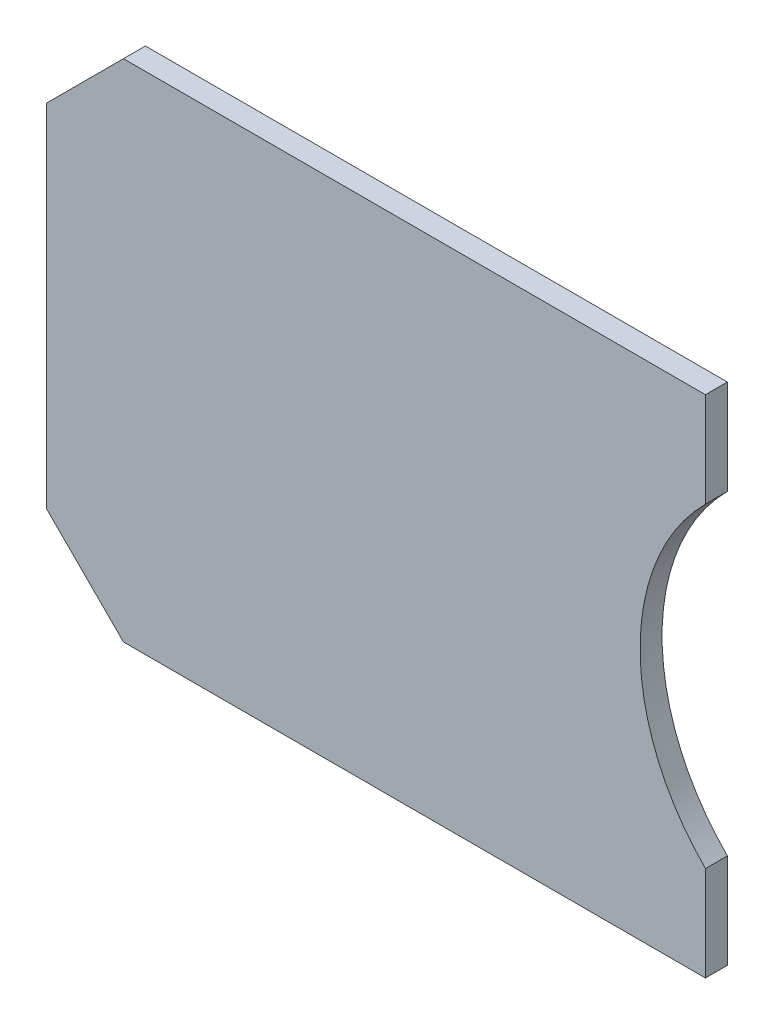
ISO-10303-21;
HEADER;
FILE_DESCRIPTION(('STEP AP214'),'2;1');
FILE_NAME('part.step','',(''),(''),'','','');
FILE_SCHEMA(('AUTOMOTIVE_DESIGN { 1 0 10303 214 1 1 1 1 }'));
ENDSEC;
DATA;
#1=APPLICATION_CONTEXT('core data for automotive mechanical design processes');
#2=APPLICATION_PROTOCOL_DEFINITION('international standard','automotive_design',2000,#1);
#3=PRODUCT_CONTEXT('',#1,'mechanical');
#4=PRODUCT('Part','Part','',(#3));
#5=PRODUCT_RELATED_PRODUCT_CATEGORY('part','',(#4));
#6=PRODUCT_DEFINITION_FORMATION('','',#4);
#7=PRODUCT_DEFINITION_CONTEXT('part definition',#1,'design');
#8=PRODUCT_DEFINITION('design','',#6,#7);
#9=PRODUCT_DEFINITION_SHAPE('','',#8);
#10=(LENGTH_UNIT() NAMED_UNIT(*) SI_UNIT(.MILLI.,.METRE.));
#11=(NAMED_UNIT(*) PLANE_ANGLE_UNIT() SI_UNIT($,.RADIAN.));
#12=(NAMED_UNIT(*) SI_UNIT($,.STERADIAN.) SOLID_ANGLE_UNIT());
#13=UNCERTAINTY_MEASURE_WITH_UNIT(LENGTH_MEASURE(1.E-05),#10,'distance_accuracy_value','');
#14=(GEOMETRIC_REPRESENTATION_CONTEXT(3) GLOBAL_UNCERTAINTY_ASSIGNED_CONTEXT((#13)) GLOBAL_UNIT_ASSIGNED_CONTEXT((#10,
#11,#12)) REPRESENTATION_CONTEXT('',''));
#15=CARTESIAN_POINT('',(0.,0.,0.));
#16=DIRECTION('',(0.,0.,1.));
#17=DIRECTION('',(1.,0.,0.));
#18=AXIS2_PLACEMENT_3D('',#15,#16,#17);
#19=CARTESIAN_POINT('',(20.45,-10.2865378923355,0.1));
#20=DIRECTION('',(1.,0.,0.));
#21=DIRECTION('',(0.,0.,-1.));
#22=AXIS2_PLACEMENT_3D('',#19,#20,#21);
#23=PLANE('',#22);
#24=DIRECTION('',(0.,-1.,0.));
#25=VECTOR('',#24,1.);
#26=CARTESIAN_POINT('',(20.45,-10.2865378923355,0.));
#27=LINE('',#26,#25);
#28=CARTESIAN_POINT('',(20.45,-10.2865378923355,0.));
#29=VERTEX_POINT('',#28);
#30=CARTESIAN_POINT('',(20.45,-10.7180262614696,0.));
#31=VERTEX_POINT('',#30);
#32=EDGE_CURVE('E135',#29,#31,#27,.T.);
#33=ORIENTED_EDGE('',*,*,#32,.F.);
#34=DIRECTION('',(0.,0.,-1.));
#35=VECTOR('',#34,1.);
#36=CARTESIAN_POINT('',(20.45,-10.2865378923355,0.1));
#37=LINE('',#36,#35);
#38=CARTESIAN_POINT('',(20.45,-10.2865378923355,0.1));
#39=VERTEX_POINT('',#38);
#40=EDGE_CURVE('E11',#39,#29,#37,.T.);
#41=ORIENTED_EDGE('',*,*,#40,.F.);
#42=DIRECTION('',(0.,-1.,0.));
#43=VECTOR('',#42,1.);
#44=CARTESIAN_POINT('',(20.45,-10.2865378923355,0.1));
#45=LINE('',#44,#43);
#46=CARTESIAN_POINT('',(20.45,-10.7180262614696,0.1));
#47=VERTEX_POINT('',#46);
#48=EDGE_CURVE('E154',#39,#47,#45,.T.);
#49=ORIENTED_EDGE('',*,*,#48,.T.);
#50=DIRECTION('',(0.,0.,-1.));
#51=VECTOR('',#50,1.);
#52=CARTESIAN_POINT('',(20.45,-10.7180262614696,0.1));
#53=LINE('',#52,#51);
#54=EDGE_CURVE('E42',#47,#31,#53,.T.);
#55=ORIENTED_EDGE('',*,*,#54,.T.);
#56=EDGE_LOOP('',(#33,#41,#49,#55));
#57=FACE_BOUND('',#56,.T.);
#58=ADVANCED_FACE('F39',(#57),#23,.T.);
#59=CARTESIAN_POINT('',(21.1685116308659,-9.56802626146959,0.1));
#60=DIRECTION('',(0.,0.,-1.));
#61=DIRECTION('',(-1.,0.,0.));
#62=AXIS2_PLACEMENT_3D('',#59,#60,#61);
#63=CYLINDRICAL_SURFACE('',#62,1.01612889309335);
#64=CARTESIAN_POINT('',(21.1685116308659,-9.56802626146959,0.));
#65=DIRECTION('',(0.,0.,1.));
#66=DIRECTION('',(1.,0.,0.));
#67=AXIS2_PLACEMENT_3D('',#64,#65,#66);
#68=CIRCLE('',#67,1.01612889309335);
#69=CARTESIAN_POINT('',(20.45,-8.8495146306037,0.));
#70=VERTEX_POINT('',#69);
#71=EDGE_CURVE('E152',#70,#29,#68,.T.);
#72=ORIENTED_EDGE('',*,*,#71,.F.);
#73=DIRECTION('',(0.,0.,-1.));
#74=VECTOR('',#73,1.);
#75=CARTESIAN_POINT('',(20.45,-8.8495146306037,0.1));
#76=LINE('',#75,#74);
#77=CARTESIAN_POINT('',(20.45,-8.8495146306037,0.1));
#78=VERTEX_POINT('',#77);
#79=EDGE_CURVE('E48',#78,#70,#76,.T.);
#80=ORIENTED_EDGE('',*,*,#79,.F.);
#81=CARTESIAN_POINT('',(21.1685116308659,-9.56802626146959,0.1));
#82=DIRECTION('',(0.,0.,1.));
#83=DIRECTION('',(1.,0.,0.));
#84=AXIS2_PLACEMENT_3D('',#81,#82,#83);
#85=CIRCLE('',#84,1.01612889309335);
#86=EDGE_CURVE('E115',#78,#39,#85,.T.);
#87=ORIENTED_EDGE('',*,*,#86,.T.);
#88=ORIENTED_EDGE('',*,*,#40,.T.);
#89=EDGE_LOOP('',(#72,#80,#87,#88));
#90=FACE_BOUND('',#89,.T.);
#91=ADVANCED_FACE('F167',(#90),#63,.F.);
#92=CARTESIAN_POINT('',(20.45,-8.8495146306037,0.1));
#93=DIRECTION('',(-1.,0.,0.));
#94=DIRECTION('',(0.,0.,1.));
#95=AXIS2_PLACEMENT_3D('',#92,#93,#94);
#96=PLANE('',#95);
#97=DIRECTION('',(0.,1.,0.));
#98=VECTOR('',#97,1.);
#99=CARTESIAN_POINT('',(20.45,-8.8495146306037,0.));
#100=LINE('',#99,#98);
#101=CARTESIAN_POINT('',(20.45,-8.41802626146959,0.));
#102=VERTEX_POINT('',#101);
#103=EDGE_CURVE('E120',#70,#102,#100,.T.);
#104=ORIENTED_EDGE('',*,*,#103,.T.);
#105=DIRECTION('',(0.,0.,-1.));
#106=VECTOR('',#105,1.);
#107=CARTESIAN_POINT('',(20.45,-8.41802626146959,0.1));
#108=LINE('',#107,#106);
#109=CARTESIAN_POINT('',(20.45,-8.41802626146959,0.1));
#110=VERTEX_POINT('',#109);
#111=EDGE_CURVE('E118',#110,#102,#108,.T.);
#112=ORIENTED_EDGE('',*,*,#111,.F.);
#113=DIRECTION('',(0.,1.,0.));
#114=VECTOR('',#113,1.);
#115=CARTESIAN_POINT('',(20.45,-8.8495146306037,0.1));
#116=LINE('',#115,#114);
#117=EDGE_CURVE('E109',#78,#110,#116,.T.);
#118=ORIENTED_EDGE('',*,*,#117,.F.);
#119=ORIENTED_EDGE('',*,*,#79,.T.);
#120=EDGE_LOOP('',(#104,#112,#118,#119));
#121=FACE_BOUND('',#120,.T.);
#122=ADVANCED_FACE('F119',(#121),#96,.F.);
#123=CARTESIAN_POINT('',(20.45,-8.41802626146959,0.1));
#124=DIRECTION('',(0.,-1.,0.));
#125=DIRECTION('',(0.,0.,-1.));
#126=AXIS2_PLACEMENT_3D('',#123,#124,#125);
#127=PLANE('',#126);
#128=DIRECTION('',(-1.,0.,0.));
#129=VECTOR('',#128,1.);
#130=CARTESIAN_POINT('',(20.45,-8.41802626146959,0.));
#131=LINE('',#130,#129);
#132=CARTESIAN_POINT('',(17.8,-8.41802626146959,0.));
#133=VERTEX_POINT('',#132);
#134=EDGE_CURVE('E149',#102,#133,#131,.T.);
#135=ORIENTED_EDGE('',*,*,#134,.T.);
#136=DIRECTION('',(0.,0.,-1.));
#137=VECTOR('',#136,1.);
#138=CARTESIAN_POINT('',(17.8,-8.41802626146959,0.1));
#139=LINE('',#138,#137);
#140=CARTESIAN_POINT('',(17.8,-8.41802626146959,0.1));
#141=VERTEX_POINT('',#140);
#142=EDGE_CURVE('E123',#141,#133,#139,.T.);
#143=ORIENTED_EDGE('',*,*,#142,.F.);
#144=DIRECTION('',(-1.,0.,0.));
#145=VECTOR('',#144,1.);
#146=CARTESIAN_POINT('',(20.45,-8.41802626146959,0.1));
#147=LINE('',#146,#145);
#148=EDGE_CURVE('E113',#110,#141,#147,.T.);
#149=ORIENTED_EDGE('',*,*,#148,.F.);
#150=ORIENTED_EDGE('',*,*,#111,.T.);
#151=EDGE_LOOP('',(#135,#143,#149,#150));
#152=FACE_BOUND('',#151,.T.);
#153=ADVANCED_FACE('F125',(#152),#127,.F.);
#154=CARTESIAN_POINT('',(17.8,-8.41802626146959,0.1));
#155=DIRECTION('',(0.707106781186546,-0.707106781186549,0.));
#156=DIRECTION('',(0.707106781186549,0.707106781186546,0.));
#157=AXIS2_PLACEMENT_3D('',#154,#155,#156);
#158=PLANE('',#157);
#159=DIRECTION('',(-0.707106781186549,-0.707106781186546,0.));
#160=VECTOR('',#159,1.);
#161=CARTESIAN_POINT('',(17.8,-8.41802626146959,0.));
#162=LINE('',#161,#160);
#163=CARTESIAN_POINT('',(17.45,-8.76802626146959,0.));
#164=VERTEX_POINT('',#163);
#165=EDGE_CURVE('E147',#133,#164,#162,.T.);
#166=ORIENTED_EDGE('',*,*,#165,.T.);
#167=DIRECTION('',(0.,0.,-1.));
#168=VECTOR('',#167,1.);
#169=CARTESIAN_POINT('',(17.45,-8.76802626146959,0.1));
#170=LINE('',#169,#168);
#171=CARTESIAN_POINT('',(17.45,-8.76802626146959,0.1));
#172=VERTEX_POINT('',#171);
#173=EDGE_CURVE('E158',#172,#164,#170,.T.);
#174=ORIENTED_EDGE('',*,*,#173,.F.);
#175=DIRECTION('',(-0.707106781186549,-0.707106781186546,0.));
#176=VECTOR('',#175,1.);
#177=CARTESIAN_POINT('',(17.8,-8.41802626146959,0.1));
#178=LINE('',#177,#176);
#179=EDGE_CURVE('E128',#141,#172,#178,.T.);
#180=ORIENTED_EDGE('',*,*,#179,.F.);
#181=ORIENTED_EDGE('',*,*,#142,.T.);
#182=EDGE_LOOP('',(#166,#174,#180,#181));
#183=FACE_BOUND('',#182,.T.);
#184=ADVANCED_FACE('F180',(#183),#158,.F.);
#185=CARTESIAN_POINT('',(17.45,-8.76802626146959,0.1));
#186=DIRECTION('',(1.,0.,0.));
#187=DIRECTION('',(0.,0.,-1.));
#188=AXIS2_PLACEMENT_3D('',#185,#186,#187);
#189=PLANE('',#188);
#190=DIRECTION('',(0.,-1.,0.));
#191=VECTOR('',#190,1.);
#192=CARTESIAN_POINT('',(17.45,-8.76802626146959,0.));
#193=LINE('',#192,#191);
#194=CARTESIAN_POINT('',(17.45,-10.3680262614696,0.));
#195=VERTEX_POINT('',#194);
#196=EDGE_CURVE('E144',#164,#195,#193,.T.);
#197=ORIENTED_EDGE('',*,*,#196,.T.);
#198=DIRECTION('',(0.,0.,-1.));
#199=VECTOR('',#198,1.);
#200=CARTESIAN_POINT('',(17.45,-10.3680262614696,0.1));
#201=LINE('',#200,#199);
#202=CARTESIAN_POINT('',(17.45,-10.3680262614696,0.1));
#203=VERTEX_POINT('',#202);
#204=EDGE_CURVE('E161',#203,#195,#201,.T.);
#205=ORIENTED_EDGE('',*,*,#204,.F.);
#206=DIRECTION('',(0.,-1.,0.));
#207=VECTOR('',#206,1.);
#208=CARTESIAN_POINT('',(17.45,-8.76802626146959,0.1));
#209=LINE('',#208,#207);
#210=EDGE_CURVE('E130',#172,#203,#209,.T.);
#211=ORIENTED_EDGE('',*,*,#210,.F.);
#212=ORIENTED_EDGE('',*,*,#173,.T.);
#213=EDGE_LOOP('',(#197,#205,#211,#212));
#214=FACE_BOUND('',#213,.T.);
#215=ADVANCED_FACE('F183',(#214),#189,.F.);
#216=CARTESIAN_POINT('',(17.8,-10.7180262614696,0.1));
#217=DIRECTION('',(-0.707106781186546,-0.707106781186549,0.));
#218=DIRECTION('',(0.707106781186549,-0.707106781186546,0.));
#219=AXIS2_PLACEMENT_3D('',#216,#217,#218);
#220=PLANE('',#219);
#221=DIRECTION('',(-0.707106781186549,0.707106781186546,0.));
#222=VECTOR('',#221,1.);
#223=CARTESIAN_POINT('',(17.8,-10.7180262614696,0.));
#224=LINE('',#223,#222);
#225=CARTESIAN_POINT('',(17.8,-10.7180262614696,0.));
#226=VERTEX_POINT('',#225);
#227=EDGE_CURVE('E141',#226,#195,#224,.T.);
#228=ORIENTED_EDGE('',*,*,#227,.F.);
#229=DIRECTION('',(0.,0.,-1.));
#230=VECTOR('',#229,1.);
#231=CARTESIAN_POINT('',(17.8,-10.7180262614696,0.1));
#232=LINE('',#231,#230);
#233=CARTESIAN_POINT('',(17.8,-10.7180262614696,0.1));
#234=VERTEX_POINT('',#233);
#235=EDGE_CURVE('E162',#234,#226,#232,.T.);
#236=ORIENTED_EDGE('',*,*,#235,.F.);
#237=DIRECTION('',(-0.707106781186549,0.707106781186546,0.));
#238=VECTOR('',#237,1.);
#239=CARTESIAN_POINT('',(17.8,-10.7180262614696,0.1));
#240=LINE('',#239,#238);
#241=EDGE_CURVE('E259',#234,#203,#240,.T.);
#242=ORIENTED_EDGE('',*,*,#241,.T.);
#243=ORIENTED_EDGE('',*,*,#204,.T.);
#244=EDGE_LOOP('',(#228,#236,#242,#243));
#245=FACE_BOUND('',#244,.T.);
#246=ADVANCED_FACE('F187',(#245),#220,.T.);
#247=CARTESIAN_POINT('',(20.45,-10.7180262614696,0.1));
#248=DIRECTION('',(0.,-1.,0.));
#249=DIRECTION('',(0.,0.,-1.));
#250=AXIS2_PLACEMENT_3D('',#247,#248,#249);
#251=PLANE('',#250);
#252=DIRECTION('',(-1.,0.,0.));
#253=VECTOR('',#252,1.);
#254=CARTESIAN_POINT('',(20.45,-10.7180262614696,0.));
#255=LINE('',#254,#253);
#256=EDGE_CURVE('E138',#31,#226,#255,.T.);
#257=ORIENTED_EDGE('',*,*,#256,.F.);
#258=ORIENTED_EDGE('',*,*,#54,.F.);
#259=DIRECTION('',(-1.,0.,0.));
#260=VECTOR('',#259,1.);
#261=CARTESIAN_POINT('',(20.45,-10.7180262614696,0.1));
#262=LINE('',#261,#260);
#263=EDGE_CURVE('E260',#47,#234,#262,.T.);
#264=ORIENTED_EDGE('',*,*,#263,.T.);
#265=ORIENTED_EDGE('',*,*,#235,.T.);
#266=EDGE_LOOP('',(#257,#258,#264,#265));
#267=FACE_BOUND('',#266,.T.);
#268=ADVANCED_FACE('F164',(#267),#251,.T.);
#269=CARTESIAN_POINT('',(21.1685116308659,-9.56802626146959,0.1));
#270=DIRECTION('',(0.,0.,1.));
#271=DIRECTION('',(1.,0.,0.));
#272=AXIS2_PLACEMENT_3D('',#269,#270,#271);
#273=PLANE('',#272);
#274=ORIENTED_EDGE('',*,*,#48,.F.);
#275=ORIENTED_EDGE('',*,*,#86,.F.);
#276=ORIENTED_EDGE('',*,*,#117,.T.);
#277=ORIENTED_EDGE('',*,*,#148,.T.);
#278=ORIENTED_EDGE('',*,*,#179,.T.);
#279=ORIENTED_EDGE('',*,*,#210,.T.);
#280=ORIENTED_EDGE('',*,*,#241,.F.);
#281=ORIENTED_EDGE('',*,*,#263,.F.);
#282=EDGE_LOOP('',(#274,#275,#276,#277,#278,#279,#280,#281));
#283=FACE_BOUND('',#282,.T.);
#284=ADVANCED_FACE('F111',(#283),#273,.T.);
#285=CARTESIAN_POINT('',(21.1685116308659,-9.56802626146959,0.));
#286=DIRECTION('',(0.,0.,1.));
#287=DIRECTION('',(1.,0.,0.));
#288=AXIS2_PLACEMENT_3D('',#285,#286,#287);
#289=PLANE('',#288);
#290=ORIENTED_EDGE('',*,*,#32,.T.);
#291=ORIENTED_EDGE('',*,*,#256,.T.);
#292=ORIENTED_EDGE('',*,*,#227,.T.);
#293=ORIENTED_EDGE('',*,*,#196,.F.);
#294=ORIENTED_EDGE('',*,*,#165,.F.);
#295=ORIENTED_EDGE('',*,*,#134,.F.);
#296=ORIENTED_EDGE('',*,*,#103,.F.);
#297=ORIENTED_EDGE('',*,*,#71,.T.);
#298=EDGE_LOOP('',(#290,#291,#292,#293,#294,#295,#296,#297));
#299=FACE_BOUND('',#298,.T.);
#300=ADVANCED_FACE('F166',(#299),#289,.F.);
#301=CLOSED_SHELL('',(#58,#91,#122,#153,#184,#215,#246,#268,#284,#300));
#302=MANIFOLD_SOLID_BREP('B2',#301);
#303=ADVANCED_BREP_SHAPE_REPRESENTATION('',(#18,#302),#14);
#304=SHAPE_DEFINITION_REPRESENTATION(#9,#303);
ENDSEC;
END-ISO-10303-21;
